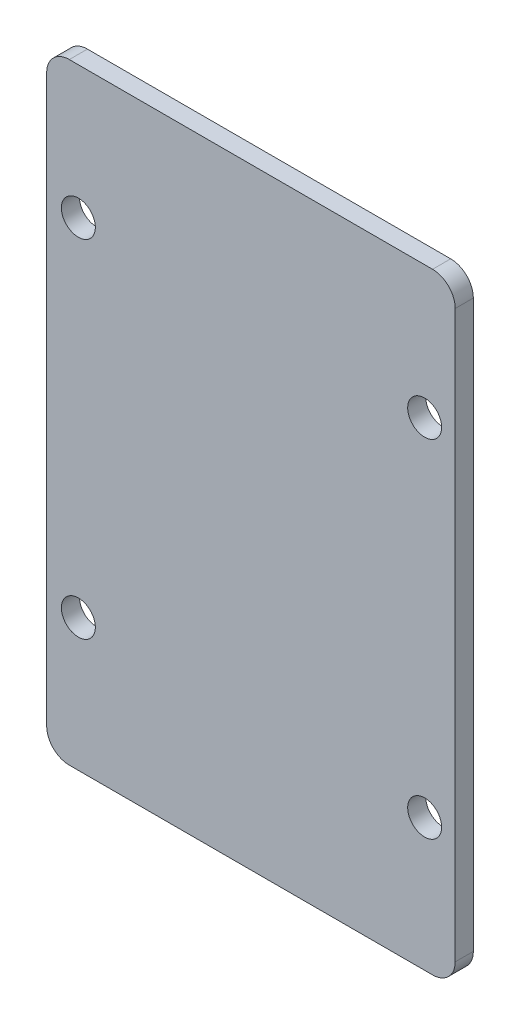
ISO-10303-21;
HEADER;
FILE_DESCRIPTION(('STEP AP214'),'2;1');
FILE_NAME('part.step','',(''),(''),'','','');
FILE_SCHEMA(('AUTOMOTIVE_DESIGN { 1 0 10303 214 1 1 1 1 }'));
ENDSEC;
DATA;
#1=APPLICATION_CONTEXT('core data for automotive mechanical design processes');
#2=APPLICATION_PROTOCOL_DEFINITION('international standard','automotive_design',2000,#1);
#3=PRODUCT_CONTEXT('',#1,'mechanical');
#4=PRODUCT('Part','Part','',(#3));
#5=PRODUCT_RELATED_PRODUCT_CATEGORY('part','',(#4));
#6=PRODUCT_DEFINITION_FORMATION('','',#4);
#7=PRODUCT_DEFINITION_CONTEXT('part definition',#1,'design');
#8=PRODUCT_DEFINITION('design','',#6,#7);
#9=PRODUCT_DEFINITION_SHAPE('','',#8);
#10=(LENGTH_UNIT() NAMED_UNIT(*) SI_UNIT(.MILLI.,.METRE.));
#11=(NAMED_UNIT(*) PLANE_ANGLE_UNIT() SI_UNIT($,.RADIAN.));
#12=(NAMED_UNIT(*) SI_UNIT($,.STERADIAN.) SOLID_ANGLE_UNIT());
#13=UNCERTAINTY_MEASURE_WITH_UNIT(LENGTH_MEASURE(1.E-05),#10,'distance_accuracy_value','');
#14=(GEOMETRIC_REPRESENTATION_CONTEXT(3) GLOBAL_UNCERTAINTY_ASSIGNED_CONTEXT((#13)) GLOBAL_UNIT_ASSIGNED_CONTEXT((#10,
#11,#12)) REPRESENTATION_CONTEXT('',''));
#15=CARTESIAN_POINT('',(0.,0.,0.));
#16=DIRECTION('',(0.,0.,1.));
#17=DIRECTION('',(1.,0.,0.));
#18=AXIS2_PLACEMENT_3D('',#15,#16,#17);
#19=CARTESIAN_POINT('',(149.749904347593,2.,1.6));
#20=DIRECTION('',(0.,0.,1.));
#21=DIRECTION('',(1.,0.,0.));
#22=AXIS2_PLACEMENT_3D('',#19,#20,#21);
#23=PLANE('',#22);
#24=CARTESIAN_POINT('',(118.449904347593,11.7,1.6));
#25=DIRECTION('',(0.,0.,1.));
#26=DIRECTION('',(1.,0.,0.));
#27=AXIS2_PLACEMENT_3D('',#24,#25,#26);
#28=CIRCLE('',#27,1.5);
#29=CARTESIAN_POINT('',(119.949904347593,11.7,1.6));
#30=VERTEX_POINT('',#29);
#31=EDGE_CURVE('E189',#30,#30,#28,.T.);
#32=ORIENTED_EDGE('',*,*,#31,.F.);
#33=EDGE_LOOP('',(#32));
#34=FACE_BOUND('',#33,.T.);
#35=CARTESIAN_POINT('',(149.049904347593,42.3,1.6));
#36=DIRECTION('',(0.,0.,1.));
#37=DIRECTION('',(1.,0.,0.));
#38=AXIS2_PLACEMENT_3D('',#35,#36,#37);
#39=CIRCLE('',#38,1.5);
#40=CARTESIAN_POINT('',(150.549904347593,42.3,1.6));
#41=VERTEX_POINT('',#40);
#42=EDGE_CURVE('E135',#41,#41,#39,.T.);
#43=ORIENTED_EDGE('',*,*,#42,.F.);
#44=EDGE_LOOP('',(#43));
#45=FACE_BOUND('',#44,.T.);
#46=CARTESIAN_POINT('',(149.749904347593,2.,1.6));
#47=DIRECTION('',(0.,0.,1.));
#48=DIRECTION('',(1.,0.,0.));
#49=AXIS2_PLACEMENT_3D('',#46,#47,#48);
#50=CIRCLE('',#49,2.00000000000001);
#51=CARTESIAN_POINT('',(149.749904347593,0.,1.6));
#52=VERTEX_POINT('',#51);
#53=CARTESIAN_POINT('',(151.749904347593,2.,1.6));
#54=VERTEX_POINT('',#53);
#55=EDGE_CURVE('E146',#52,#54,#50,.T.);
#56=ORIENTED_EDGE('',*,*,#55,.T.);
#57=DIRECTION('',(0.,1.,0.));
#58=VECTOR('',#57,1.);
#59=CARTESIAN_POINT('',(151.749904347593,2.,1.6));
#60=LINE('',#59,#58);
#61=CARTESIAN_POINT('',(151.749904347593,52.,1.6));
#62=VERTEX_POINT('',#61);
#63=EDGE_CURVE('E94',#54,#62,#60,.T.);
#64=ORIENTED_EDGE('',*,*,#63,.T.);
#65=CARTESIAN_POINT('',(149.749904347593,52.,1.6));
#66=DIRECTION('',(0.,0.,1.));
#67=DIRECTION('',(1.,0.,0.));
#68=AXIS2_PLACEMENT_3D('',#65,#66,#67);
#69=CIRCLE('',#68,2.);
#70=CARTESIAN_POINT('',(149.749904347593,54.,1.6));
#71=VERTEX_POINT('',#70);
#72=EDGE_CURVE('E161',#62,#71,#69,.T.);
#73=ORIENTED_EDGE('',*,*,#72,.T.);
#74=DIRECTION('',(-1.,0.,0.));
#75=VECTOR('',#74,1.);
#76=CARTESIAN_POINT('',(149.749904347593,54.,1.6));
#77=LINE('',#76,#75);
#78=CARTESIAN_POINT('',(117.649904347593,54.,1.6));
#79=VERTEX_POINT('',#78);
#80=EDGE_CURVE('E174',#71,#79,#77,.T.);
#81=ORIENTED_EDGE('',*,*,#80,.T.);
#82=CARTESIAN_POINT('',(117.649904347593,52.,1.6));
#83=DIRECTION('',(0.,0.,1.));
#84=DIRECTION('',(-1.,0.,0.));
#85=AXIS2_PLACEMENT_3D('',#82,#83,#84);
#86=CIRCLE('',#85,2.00000000000001);
#87=CARTESIAN_POINT('',(115.649904347593,52.,1.6));
#88=VERTEX_POINT('',#87);
#89=EDGE_CURVE('E113',#79,#88,#86,.T.);
#90=ORIENTED_EDGE('',*,*,#89,.T.);
#91=DIRECTION('',(0.,-1.,0.));
#92=VECTOR('',#91,1.);
#93=CARTESIAN_POINT('',(115.649904347593,52.,1.6));
#94=LINE('',#93,#92);
#95=CARTESIAN_POINT('',(115.649904347593,2.,1.6));
#96=VERTEX_POINT('',#95);
#97=EDGE_CURVE('E107',#88,#96,#94,.T.);
#98=ORIENTED_EDGE('',*,*,#97,.T.);
#99=CARTESIAN_POINT('',(117.649904347593,2.,1.6));
#100=DIRECTION('',(0.,0.,1.));
#101=DIRECTION('',(1.,0.,0.));
#102=AXIS2_PLACEMENT_3D('',#99,#100,#101);
#103=CIRCLE('',#102,2.);
#104=CARTESIAN_POINT('',(117.649904347593,0.,1.6));
#105=VERTEX_POINT('',#104);
#106=EDGE_CURVE('E111',#96,#105,#103,.T.);
#107=ORIENTED_EDGE('',*,*,#106,.T.);
#108=DIRECTION('',(1.,0.,0.));
#109=VECTOR('',#108,1.);
#110=CARTESIAN_POINT('',(117.649904347593,0.,1.6));
#111=LINE('',#110,#109);
#112=EDGE_CURVE('E51',#105,#52,#111,.T.);
#113=ORIENTED_EDGE('',*,*,#112,.T.);
#114=EDGE_LOOP('',(#56,#64,#73,#81,#90,#98,#107,#113));
#115=FACE_BOUND('',#114,.T.);
#116=CARTESIAN_POINT('',(149.049904347593,11.7,1.6));
#117=DIRECTION('',(0.,0.,1.));
#118=DIRECTION('',(1.,0.,0.));
#119=AXIS2_PLACEMENT_3D('',#116,#117,#118);
#120=CIRCLE('',#119,1.5);
#121=CARTESIAN_POINT('',(150.549904347593,11.7,1.6));
#122=VERTEX_POINT('',#121);
#123=EDGE_CURVE('E183',#122,#122,#120,.T.);
#124=ORIENTED_EDGE('',*,*,#123,.F.);
#125=EDGE_LOOP('',(#124));
#126=FACE_BOUND('',#125,.T.);
#127=CARTESIAN_POINT('',(118.449904347593,42.3,1.6));
#128=DIRECTION('',(0.,0.,1.));
#129=DIRECTION('',(1.,0.,0.));
#130=AXIS2_PLACEMENT_3D('',#127,#128,#129);
#131=CIRCLE('',#130,1.5);
#132=CARTESIAN_POINT('',(119.949904347593,42.3,1.6));
#133=VERTEX_POINT('',#132);
#134=EDGE_CURVE('E195',#133,#133,#131,.T.);
#135=ORIENTED_EDGE('',*,*,#134,.F.);
#136=EDGE_LOOP('',(#135));
#137=FACE_BOUND('',#136,.T.);
#138=ADVANCED_FACE('F34',(#34,#45,#115,#126,#137),#23,.T.);
#139=CARTESIAN_POINT('',(149.749904347593,2.,0.));
#140=DIRECTION('',(0.,0.,1.));
#141=DIRECTION('',(1.,0.,0.));
#142=AXIS2_PLACEMENT_3D('',#139,#140,#141);
#143=PLANE('',#142);
#144=CARTESIAN_POINT('',(149.749904347593,2.,0.));
#145=DIRECTION('',(0.,0.,1.));
#146=DIRECTION('',(1.,0.,0.));
#147=AXIS2_PLACEMENT_3D('',#144,#145,#146);
#148=CIRCLE('',#147,2.00000000000001);
#149=CARTESIAN_POINT('',(149.749904347593,0.,0.));
#150=VERTEX_POINT('',#149);
#151=CARTESIAN_POINT('',(151.749904347593,2.,0.));
#152=VERTEX_POINT('',#151);
#153=EDGE_CURVE('E131',#150,#152,#148,.T.);
#154=ORIENTED_EDGE('',*,*,#153,.F.);
#155=DIRECTION('',(1.,0.,0.));
#156=VECTOR('',#155,1.);
#157=CARTESIAN_POINT('',(117.649904347593,0.,0.));
#158=LINE('',#157,#156);
#159=CARTESIAN_POINT('',(117.649904347593,0.,0.));
#160=VERTEX_POINT('',#159);
#161=EDGE_CURVE('E86',#160,#150,#158,.T.);
#162=ORIENTED_EDGE('',*,*,#161,.F.);
#163=CARTESIAN_POINT('',(117.649904347593,2.,0.));
#164=DIRECTION('',(0.,0.,1.));
#165=DIRECTION('',(1.,0.,0.));
#166=AXIS2_PLACEMENT_3D('',#163,#164,#165);
#167=CIRCLE('',#166,2.);
#168=CARTESIAN_POINT('',(115.649904347593,2.,0.));
#169=VERTEX_POINT('',#168);
#170=EDGE_CURVE('E80',#169,#160,#167,.T.);
#171=ORIENTED_EDGE('',*,*,#170,.F.);
#172=DIRECTION('',(0.,-1.,0.));
#173=VECTOR('',#172,1.);
#174=CARTESIAN_POINT('',(115.649904347593,52.,0.));
#175=LINE('',#174,#173);
#176=CARTESIAN_POINT('',(115.649904347593,52.,0.));
#177=VERTEX_POINT('',#176);
#178=EDGE_CURVE('E121',#177,#169,#175,.T.);
#179=ORIENTED_EDGE('',*,*,#178,.F.);
#180=CARTESIAN_POINT('',(117.649904347593,52.,0.));
#181=DIRECTION('',(0.,0.,1.));
#182=DIRECTION('',(-1.,0.,0.));
#183=AXIS2_PLACEMENT_3D('',#180,#181,#182);
#184=CIRCLE('',#183,2.00000000000001);
#185=CARTESIAN_POINT('',(117.649904347593,54.,0.));
#186=VERTEX_POINT('',#185);
#187=EDGE_CURVE('E141',#186,#177,#184,.T.);
#188=ORIENTED_EDGE('',*,*,#187,.F.);
#189=DIRECTION('',(-1.,0.,0.));
#190=VECTOR('',#189,1.);
#191=CARTESIAN_POINT('',(149.749904347593,54.,0.));
#192=LINE('',#191,#190);
#193=CARTESIAN_POINT('',(149.749904347593,54.,0.));
#194=VERTEX_POINT('',#193);
#195=EDGE_CURVE('E139',#194,#186,#192,.T.);
#196=ORIENTED_EDGE('',*,*,#195,.F.);
#197=CARTESIAN_POINT('',(149.749904347593,52.,0.));
#198=DIRECTION('',(0.,0.,1.));
#199=DIRECTION('',(1.,0.,0.));
#200=AXIS2_PLACEMENT_3D('',#197,#198,#199);
#201=CIRCLE('',#200,2.);
#202=CARTESIAN_POINT('',(151.749904347593,52.,0.));
#203=VERTEX_POINT('',#202);
#204=EDGE_CURVE('E137',#203,#194,#201,.T.);
#205=ORIENTED_EDGE('',*,*,#204,.F.);
#206=DIRECTION('',(0.,1.,0.));
#207=VECTOR('',#206,1.);
#208=CARTESIAN_POINT('',(151.749904347593,2.,0.));
#209=LINE('',#208,#207);
#210=EDGE_CURVE('E134',#152,#203,#209,.T.);
#211=ORIENTED_EDGE('',*,*,#210,.F.);
#212=EDGE_LOOP('',(#154,#162,#171,#179,#188,#196,#205,#211));
#213=FACE_BOUND('',#212,.T.);
#214=CARTESIAN_POINT('',(149.049904347593,42.3,0.));
#215=DIRECTION('',(0.,0.,1.));
#216=DIRECTION('',(1.,0.,0.));
#217=AXIS2_PLACEMENT_3D('',#214,#215,#216);
#218=CIRCLE('',#217,1.5);
#219=CARTESIAN_POINT('',(150.549904347593,42.3,0.));
#220=VERTEX_POINT('',#219);
#221=EDGE_CURVE('E180',#220,#220,#218,.T.);
#222=ORIENTED_EDGE('',*,*,#221,.T.);
#223=EDGE_LOOP('',(#222));
#224=FACE_BOUND('',#223,.T.);
#225=CARTESIAN_POINT('',(149.049904347593,11.7,0.));
#226=DIRECTION('',(0.,0.,1.));
#227=DIRECTION('',(1.,0.,0.));
#228=AXIS2_PLACEMENT_3D('',#225,#226,#227);
#229=CIRCLE('',#228,1.5);
#230=CARTESIAN_POINT('',(150.549904347593,11.7,0.));
#231=VERTEX_POINT('',#230);
#232=EDGE_CURVE('E186',#231,#231,#229,.T.);
#233=ORIENTED_EDGE('',*,*,#232,.T.);
#234=EDGE_LOOP('',(#233));
#235=FACE_BOUND('',#234,.T.);
#236=CARTESIAN_POINT('',(118.449904347593,11.7,0.));
#237=DIRECTION('',(0.,0.,1.));
#238=DIRECTION('',(1.,0.,0.));
#239=AXIS2_PLACEMENT_3D('',#236,#237,#238);
#240=CIRCLE('',#239,1.5);
#241=CARTESIAN_POINT('',(119.949904347593,11.7,0.));
#242=VERTEX_POINT('',#241);
#243=EDGE_CURVE('E192',#242,#242,#240,.T.);
#244=ORIENTED_EDGE('',*,*,#243,.T.);
#245=EDGE_LOOP('',(#244));
#246=FACE_BOUND('',#245,.T.);
#247=CARTESIAN_POINT('',(118.449904347593,42.3,0.));
#248=DIRECTION('',(0.,0.,1.));
#249=DIRECTION('',(1.,0.,0.));
#250=AXIS2_PLACEMENT_3D('',#247,#248,#249);
#251=CIRCLE('',#250,1.5);
#252=CARTESIAN_POINT('',(119.949904347593,42.3,0.));
#253=VERTEX_POINT('',#252);
#254=EDGE_CURVE('E198',#253,#253,#251,.T.);
#255=ORIENTED_EDGE('',*,*,#254,.T.);
#256=EDGE_LOOP('',(#255));
#257=FACE_BOUND('',#256,.T.);
#258=ADVANCED_FACE('F165',(#213,#224,#235,#246,#257),#143,.F.);
#259=CARTESIAN_POINT('',(149.749904347593,2.,1.6));
#260=DIRECTION('',(0.,0.,-1.));
#261=DIRECTION('',(-1.,0.,0.));
#262=AXIS2_PLACEMENT_3D('',#259,#260,#261);
#263=CYLINDRICAL_SURFACE('',#262,2.00000000000001);
#264=ORIENTED_EDGE('',*,*,#153,.T.);
#265=DIRECTION('',(0.,0.,-1.));
#266=VECTOR('',#265,1.);
#267=CARTESIAN_POINT('',(151.749904347593,2.,1.6));
#268=LINE('',#267,#266);
#269=EDGE_CURVE('E11',#54,#152,#268,.T.);
#270=ORIENTED_EDGE('',*,*,#269,.F.);
#271=ORIENTED_EDGE('',*,*,#55,.F.);
#272=DIRECTION('',(0.,0.,-1.));
#273=VECTOR('',#272,1.);
#274=CARTESIAN_POINT('',(149.749904347593,0.,1.6));
#275=LINE('',#274,#273);
#276=EDGE_CURVE('E127',#52,#150,#275,.T.);
#277=ORIENTED_EDGE('',*,*,#276,.T.);
#278=EDGE_LOOP('',(#264,#270,#271,#277));
#279=FACE_BOUND('',#278,.T.);
#280=ADVANCED_FACE('F36',(#279),#263,.T.);
#281=CARTESIAN_POINT('',(151.749904347593,2.,1.6));
#282=DIRECTION('',(-1.,0.,0.));
#283=DIRECTION('',(0.,-1.,0.));
#284=AXIS2_PLACEMENT_3D('',#281,#282,#283);
#285=PLANE('',#284);
#286=ORIENTED_EDGE('',*,*,#210,.T.);
#287=DIRECTION('',(0.,0.,-1.));
#288=VECTOR('',#287,1.);
#289=CARTESIAN_POINT('',(151.749904347593,52.,1.6));
#290=LINE('',#289,#288);
#291=EDGE_CURVE('E43',#62,#203,#290,.T.);
#292=ORIENTED_EDGE('',*,*,#291,.F.);
#293=ORIENTED_EDGE('',*,*,#63,.F.);
#294=ORIENTED_EDGE('',*,*,#269,.T.);
#295=EDGE_LOOP('',(#286,#292,#293,#294));
#296=FACE_BOUND('',#295,.T.);
#297=ADVANCED_FACE('F232',(#296),#285,.F.);
#298=CARTESIAN_POINT('',(149.749904347593,52.,1.6));
#299=DIRECTION('',(0.,0.,-1.));
#300=DIRECTION('',(-1.,0.,0.));
#301=AXIS2_PLACEMENT_3D('',#298,#299,#300);
#302=CYLINDRICAL_SURFACE('',#301,2.);
#303=ORIENTED_EDGE('',*,*,#204,.T.);
#304=DIRECTION('',(0.,0.,-1.));
#305=VECTOR('',#304,1.);
#306=CARTESIAN_POINT('',(149.749904347593,54.,1.6));
#307=LINE('',#306,#305);
#308=EDGE_CURVE('E153',#71,#194,#307,.T.);
#309=ORIENTED_EDGE('',*,*,#308,.F.);
#310=ORIENTED_EDGE('',*,*,#72,.F.);
#311=ORIENTED_EDGE('',*,*,#291,.T.);
#312=EDGE_LOOP('',(#303,#309,#310,#311));
#313=FACE_BOUND('',#312,.T.);
#314=ADVANCED_FACE('F159',(#313),#302,.T.);
#315=CARTESIAN_POINT('',(149.749904347593,54.,1.6));
#316=DIRECTION('',(0.,-1.,0.));
#317=DIRECTION('',(0.,0.,-1.));
#318=AXIS2_PLACEMENT_3D('',#315,#316,#317);
#319=PLANE('',#318);
#320=ORIENTED_EDGE('',*,*,#195,.T.);
#321=DIRECTION('',(0.,0.,-1.));
#322=VECTOR('',#321,1.);
#323=CARTESIAN_POINT('',(117.649904347593,54.,1.6));
#324=LINE('',#323,#322);
#325=EDGE_CURVE('E150',#79,#186,#324,.T.);
#326=ORIENTED_EDGE('',*,*,#325,.F.);
#327=ORIENTED_EDGE('',*,*,#80,.F.);
#328=ORIENTED_EDGE('',*,*,#308,.T.);
#329=EDGE_LOOP('',(#320,#326,#327,#328));
#330=FACE_BOUND('',#329,.T.);
#331=ADVANCED_FACE('F170',(#330),#319,.F.);
#332=CARTESIAN_POINT('',(117.649904347593,52.,1.6));
#333=DIRECTION('',(0.,0.,-1.));
#334=DIRECTION('',(-1.,0.,0.));
#335=AXIS2_PLACEMENT_3D('',#332,#333,#334);
#336=CYLINDRICAL_SURFACE('',#335,2.00000000000001);
#337=ORIENTED_EDGE('',*,*,#187,.T.);
#338=DIRECTION('',(0.,0.,-1.));
#339=VECTOR('',#338,1.);
#340=CARTESIAN_POINT('',(115.649904347593,52.,1.6));
#341=LINE('',#340,#339);
#342=EDGE_CURVE('E122',#88,#177,#341,.T.);
#343=ORIENTED_EDGE('',*,*,#342,.F.);
#344=ORIENTED_EDGE('',*,*,#89,.F.);
#345=ORIENTED_EDGE('',*,*,#325,.T.);
#346=EDGE_LOOP('',(#337,#343,#344,#345));
#347=FACE_BOUND('',#346,.T.);
#348=ADVANCED_FACE('F173',(#347),#336,.T.);
#349=CARTESIAN_POINT('',(115.649904347593,52.,1.6));
#350=DIRECTION('',(1.,0.,0.));
#351=DIRECTION('',(0.,1.,0.));
#352=AXIS2_PLACEMENT_3D('',#349,#350,#351);
#353=PLANE('',#352);
#354=ORIENTED_EDGE('',*,*,#178,.T.);
#355=DIRECTION('',(0.,0.,-1.));
#356=VECTOR('',#355,1.);
#357=CARTESIAN_POINT('',(115.649904347593,2.,1.6));
#358=LINE('',#357,#356);
#359=EDGE_CURVE('E118',#96,#169,#358,.T.);
#360=ORIENTED_EDGE('',*,*,#359,.F.);
#361=ORIENTED_EDGE('',*,*,#97,.F.);
#362=ORIENTED_EDGE('',*,*,#342,.T.);
#363=EDGE_LOOP('',(#354,#360,#361,#362));
#364=FACE_BOUND('',#363,.T.);
#365=ADVANCED_FACE('F119',(#364),#353,.F.);
#366=CARTESIAN_POINT('',(117.649904347593,2.,1.6));
#367=DIRECTION('',(0.,0.,-1.));
#368=DIRECTION('',(-1.,0.,0.));
#369=AXIS2_PLACEMENT_3D('',#366,#367,#368);
#370=CYLINDRICAL_SURFACE('',#369,2.);
#371=ORIENTED_EDGE('',*,*,#170,.T.);
#372=DIRECTION('',(0.,0.,-1.));
#373=VECTOR('',#372,1.);
#374=CARTESIAN_POINT('',(117.649904347593,0.,1.6));
#375=LINE('',#374,#373);
#376=EDGE_CURVE('E123',#105,#160,#375,.T.);
#377=ORIENTED_EDGE('',*,*,#376,.F.);
#378=ORIENTED_EDGE('',*,*,#106,.F.);
#379=ORIENTED_EDGE('',*,*,#359,.T.);
#380=EDGE_LOOP('',(#371,#377,#378,#379));
#381=FACE_BOUND('',#380,.T.);
#382=ADVANCED_FACE('F125',(#381),#370,.T.);
#383=CARTESIAN_POINT('',(117.649904347593,0.,1.6));
#384=DIRECTION('',(0.,1.,0.));
#385=DIRECTION('',(0.,0.,1.));
#386=AXIS2_PLACEMENT_3D('',#383,#384,#385);
#387=PLANE('',#386);
#388=ORIENTED_EDGE('',*,*,#161,.T.);
#389=ORIENTED_EDGE('',*,*,#276,.F.);
#390=ORIENTED_EDGE('',*,*,#112,.F.);
#391=ORIENTED_EDGE('',*,*,#376,.T.);
#392=EDGE_LOOP('',(#388,#389,#390,#391));
#393=FACE_BOUND('',#392,.T.);
#394=ADVANCED_FACE('F220',(#393),#387,.F.);
#395=CARTESIAN_POINT('',(149.049904347593,42.3,1.6));
#396=DIRECTION('',(0.,0.,-1.));
#397=DIRECTION('',(-1.,0.,0.));
#398=AXIS2_PLACEMENT_3D('',#395,#396,#397);
#399=CYLINDRICAL_SURFACE('',#398,1.5);
#400=ORIENTED_EDGE('',*,*,#42,.T.);
#401=EDGE_LOOP('',(#400));
#402=FACE_BOUND('',#401,.T.);
#403=ORIENTED_EDGE('',*,*,#221,.F.);
#404=EDGE_LOOP('',(#403));
#405=FACE_BOUND('',#404,.T.);
#406=ADVANCED_FACE('F217',(#402,#405),#399,.F.);
#407=CARTESIAN_POINT('',(149.049904347593,11.7,1.6));
#408=DIRECTION('',(0.,0.,-1.));
#409=DIRECTION('',(-1.,0.,0.));
#410=AXIS2_PLACEMENT_3D('',#407,#408,#409);
#411=CYLINDRICAL_SURFACE('',#410,1.5);
#412=ORIENTED_EDGE('',*,*,#123,.T.);
#413=EDGE_LOOP('',(#412));
#414=FACE_BOUND('',#413,.T.);
#415=ORIENTED_EDGE('',*,*,#232,.F.);
#416=EDGE_LOOP('',(#415));
#417=FACE_BOUND('',#416,.T.);
#418=ADVANCED_FACE('F296',(#414,#417),#411,.F.);
#419=CARTESIAN_POINT('',(118.449904347593,11.7,1.6));
#420=DIRECTION('',(0.,0.,-1.));
#421=DIRECTION('',(-1.,0.,0.));
#422=AXIS2_PLACEMENT_3D('',#419,#420,#421);
#423=CYLINDRICAL_SURFACE('',#422,1.5);
#424=ORIENTED_EDGE('',*,*,#31,.T.);
#425=EDGE_LOOP('',(#424));
#426=FACE_BOUND('',#425,.T.);
#427=ORIENTED_EDGE('',*,*,#243,.F.);
#428=EDGE_LOOP('',(#427));
#429=FACE_BOUND('',#428,.T.);
#430=ADVANCED_FACE('F304',(#426,#429),#423,.F.);
#431=CARTESIAN_POINT('',(118.449904347593,42.3,1.6));
#432=DIRECTION('',(0.,0.,-1.));
#433=DIRECTION('',(-1.,0.,0.));
#434=AXIS2_PLACEMENT_3D('',#431,#432,#433);
#435=CYLINDRICAL_SURFACE('',#434,1.5);
#436=ORIENTED_EDGE('',*,*,#134,.T.);
#437=EDGE_LOOP('',(#436));
#438=FACE_BOUND('',#437,.T.);
#439=ORIENTED_EDGE('',*,*,#254,.F.);
#440=EDGE_LOOP('',(#439));
#441=FACE_BOUND('',#440,.T.);
#442=ADVANCED_FACE('F204',(#438,#441),#435,.F.);
#443=CLOSED_SHELL('',(#138,#258,#280,#297,#314,#331,#348,#365,#382,#394,#406,#418,#430,#442));
#444=MANIFOLD_SOLID_BREP('B2',#443);
#445=ADVANCED_BREP_SHAPE_REPRESENTATION('',(#18,#444),#14);
#446=SHAPE_DEFINITION_REPRESENTATION(#9,#445);
ENDSEC;
END-ISO-10303-21;
